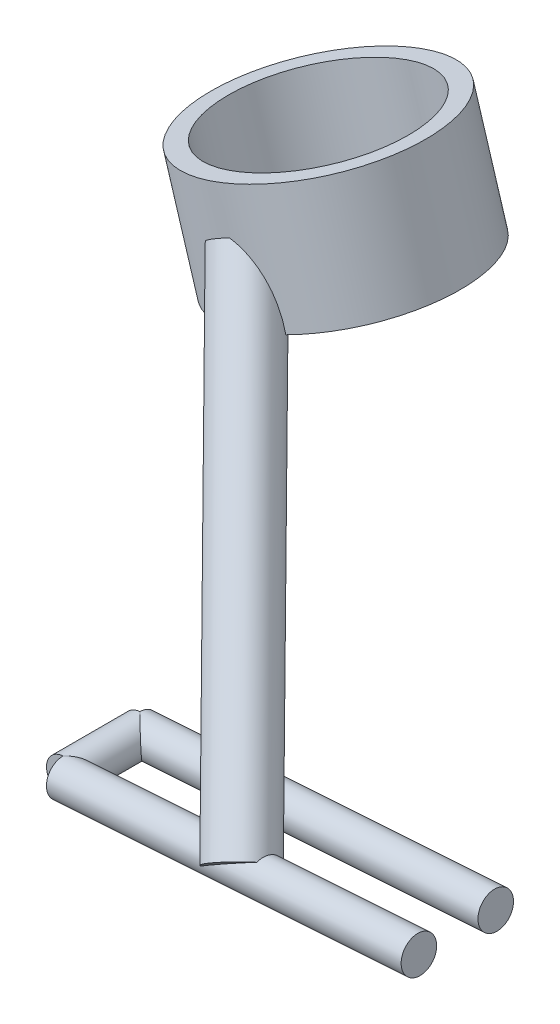
ISO-10303-21;
HEADER;
FILE_DESCRIPTION(('STEP AP214'),'2;1');
FILE_NAME('part.step','',(''),(''),'','','');
FILE_SCHEMA(('AUTOMOTIVE_DESIGN { 1 0 10303 214 1 1 1 1 }'));
ENDSEC;
DATA;
#1=APPLICATION_CONTEXT('core data for automotive mechanical design processes');
#2=APPLICATION_PROTOCOL_DEFINITION('international standard','automotive_design',2000,#1);
#3=PRODUCT_CONTEXT('',#1,'mechanical');
#4=PRODUCT('Part','Part','',(#3));
#5=PRODUCT_RELATED_PRODUCT_CATEGORY('part','',(#4));
#6=PRODUCT_DEFINITION_FORMATION('','',#4);
#7=PRODUCT_DEFINITION_CONTEXT('part definition',#1,'design');
#8=PRODUCT_DEFINITION('design','',#6,#7);
#9=PRODUCT_DEFINITION_SHAPE('','',#8);
#10=(LENGTH_UNIT() NAMED_UNIT(*) SI_UNIT(.MILLI.,.METRE.));
#11=(NAMED_UNIT(*) PLANE_ANGLE_UNIT() SI_UNIT($,.RADIAN.));
#12=(NAMED_UNIT(*) SI_UNIT($,.STERADIAN.) SOLID_ANGLE_UNIT());
#13=UNCERTAINTY_MEASURE_WITH_UNIT(LENGTH_MEASURE(1.E-05),#10,'distance_accuracy_value','');
#14=(GEOMETRIC_REPRESENTATION_CONTEXT(3) GLOBAL_UNCERTAINTY_ASSIGNED_CONTEXT((#13)) GLOBAL_UNIT_ASSIGNED_CONTEXT((#10,
#11,#12)) REPRESENTATION_CONTEXT('',''));
#15=CARTESIAN_POINT('',(0.,0.,0.));
#16=DIRECTION('',(0.,0.,1.));
#17=DIRECTION('',(1.,0.,0.));
#18=AXIS2_PLACEMENT_3D('',#15,#16,#17);
#19=CARTESIAN_POINT('',(-50.,118.,50.));
#20=DIRECTION('',(0.,0.,1.));
#21=DIRECTION('',(1.,0.,0.));
#22=AXIS2_PLACEMENT_3D('',#19,#20,#21);
#23=PLANE('',#22);
#24=CARTESIAN_POINT('',(-50.,118.,50.));
#25=DIRECTION('',(0.,0.,1.));
#26=DIRECTION('',(1.,0.,0.));
#27=AXIS2_PLACEMENT_3D('',#24,#25,#26);
#28=CIRCLE('',#27,3.);
#29=CARTESIAN_POINT('',(-50.1995570315713,120.99335547357,50.));
#30=VERTEX_POINT('',#29);
#31=CARTESIAN_POINT('',(-49.8004429684287,115.00664452643,50.));
#32=VERTEX_POINT('',#31);
#33=EDGE_CURVE('E398',#30,#32,#28,.T.);
#34=ORIENTED_EDGE('',*,*,#33,.T.);
#35=DIRECTION('',(-0.0665190105237742,0.997785157856609,0.));
#36=VECTOR('',#35,1.);
#37=CARTESIAN_POINT('',(-50.,118.,50.));
#38=LINE('',#37,#36);
#39=EDGE_CURVE('E200',#32,#30,#38,.T.);
#40=ORIENTED_EDGE('',*,*,#39,.T.);
#41=EDGE_LOOP('',(#34,#40));
#42=FACE_BOUND('',#41,.T.);
#43=ADVANCED_FACE('F69',(#42),#23,.T.);
#44=CARTESIAN_POINT('',(-50.,118.,37.));
#45=DIRECTION('',(0.997785157856609,0.0665190105237742,0.));
#46=DIRECTION('',(-0.0665190105237742,0.997785157856609,0.));
#47=AXIS2_PLACEMENT_3D('',#44,#45,#46);
#48=PLANE('',#47);
#49=DIRECTION('',(0.0665190105237742,-0.997785157856609,0.));
#50=VECTOR('',#49,1.);
#51=CARTESIAN_POINT('',(-50.,118.,37.));
#52=LINE('',#51,#50);
#53=CARTESIAN_POINT('',(-50.1995570315713,120.99335547357,37.));
#54=VERTEX_POINT('',#53);
#55=CARTESIAN_POINT('',(-49.8004429684287,115.00664452643,37.));
#56=VERTEX_POINT('',#55);
#57=EDGE_CURVE('E249',#54,#56,#52,.T.);
#58=ORIENTED_EDGE('',*,*,#57,.F.);
#59=CARTESIAN_POINT('',(-50.,118.,37.));
#60=DIRECTION('',(0.997785157856609,0.0665190105237742,0.));
#61=DIRECTION('',(-0.0665190105237742,0.997785157856609,0.));
#62=AXIS2_PLACEMENT_3D('',#59,#60,#61);
#63=CIRCLE('',#62,3.);
#64=EDGE_CURVE('E245',#56,#54,#63,.T.);
#65=ORIENTED_EDGE('',*,*,#64,.F.);
#66=EDGE_LOOP('',(#58,#65));
#67=FACE_BOUND('',#66,.T.);
#68=ADVANCED_FACE('F71',(#67),#48,.F.);
#69=CARTESIAN_POINT('',(10.,122.,37.));
#70=DIRECTION('',(0.997785157856609,0.0665190105237742,0.));
#71=DIRECTION('',(-0.0665190105237742,0.997785157856609,0.));
#72=AXIS2_PLACEMENT_3D('',#69,#70,#71);
#73=PLANE('',#72);
#74=CARTESIAN_POINT('',(10.,122.,37.));
#75=DIRECTION('',(0.997785157856609,0.0665190105237742,0.));
#76=DIRECTION('',(-0.0665190105237742,0.997785157856609,0.));
#77=AXIS2_PLACEMENT_3D('',#74,#75,#76);
#78=CIRCLE('',#77,3.);
#79=CARTESIAN_POINT('',(9.80044296842868,124.99335547357,37.));
#80=VERTEX_POINT('',#79);
#81=EDGE_CURVE('E242',#80,#80,#78,.T.);
#82=ORIENTED_EDGE('',*,*,#81,.T.);
#83=EDGE_LOOP('',(#82));
#84=FACE_BOUND('',#83,.T.);
#85=ADVANCED_FACE('F223',(#84),#73,.T.);
#86=CARTESIAN_POINT('',(-50.,118.,37.));
#87=DIRECTION('',(0.997785157856609,0.066519010523774,0.));
#88=DIRECTION('',(-0.066519010523774,0.997785157856609,0.));
#89=AXIS2_PLACEMENT_3D('',#86,#87,#88);
#90=CYLINDRICAL_SURFACE('',#89,3.);
#91=CARTESIAN_POINT('',(-50.,118.,37.));
#92=DIRECTION('',(0.705540651287698,0.0470360434191799,-0.707106781186547));
#93=DIRECTION('',(0.705540651287698,0.0470360434191799,0.707106781186547));
#94=AXIS2_PLACEMENT_3D('',#91,#92,#93);
#95=ELLIPSE('',#94,4.24264068711929,3.);
#96=EDGE_CURVE('E244',#56,#54,#95,.F.);
#97=ORIENTED_EDGE('',*,*,#96,.F.);
#98=ORIENTED_EDGE('',*,*,#64,.T.);
#99=EDGE_LOOP('',(#97,#98));
#100=FACE_BOUND('',#99,.T.);
#101=ORIENTED_EDGE('',*,*,#81,.F.);
#102=EDGE_LOOP('',(#101));
#103=FACE_BOUND('',#102,.T.);
#104=ADVANCED_FACE('F225',(#100,#103),#90,.T.);
#105=CARTESIAN_POINT('',(-50.,118.,37.));
#106=DIRECTION('',(0.,0.,1.));
#107=DIRECTION('',(1.,0.,0.));
#108=AXIS2_PLACEMENT_3D('',#105,#106,#107);
#109=PLANE('',#108);
#110=CARTESIAN_POINT('',(-50.,118.,37.));
#111=DIRECTION('',(0.,0.,1.));
#112=DIRECTION('',(1.,0.,0.));
#113=AXIS2_PLACEMENT_3D('',#110,#111,#112);
#114=CIRCLE('',#113,3.);
#115=EDGE_CURVE('E396',#54,#56,#114,.T.);
#116=ORIENTED_EDGE('',*,*,#115,.F.);
#117=ORIENTED_EDGE('',*,*,#57,.T.);
#118=EDGE_LOOP('',(#116,#117));
#119=FACE_BOUND('',#118,.T.);
#120=ADVANCED_FACE('F230',(#119),#109,.F.);
#121=CARTESIAN_POINT('',(-50.,118.,37.));
#122=DIRECTION('',(0.,0.,1.));
#123=DIRECTION('',(1.,0.,0.));
#124=AXIS2_PLACEMENT_3D('',#121,#122,#123);
#125=CYLINDRICAL_SURFACE('',#124,3.);
#126=CARTESIAN_POINT('',(-50.,118.,50.));
#127=DIRECTION('',(0.705540651287698,0.0470360434191799,0.707106781186547));
#128=DIRECTION('',(-0.705540651287698,-0.0470360434191799,0.707106781186547));
#129=AXIS2_PLACEMENT_3D('',#126,#127,#128);
#130=ELLIPSE('',#129,4.24264068711929,3.);
#131=EDGE_CURVE('E83',#32,#30,#130,.T.);
#132=ORIENTED_EDGE('',*,*,#131,.F.);
#133=ORIENTED_EDGE('',*,*,#33,.F.);
#134=EDGE_LOOP('',(#132,#133));
#135=FACE_BOUND('',#134,.T.);
#136=ORIENTED_EDGE('',*,*,#115,.T.);
#137=ORIENTED_EDGE('',*,*,#96,.T.);
#138=EDGE_LOOP('',(#136,#137));
#139=FACE_BOUND('',#138,.T.);
#140=ADVANCED_FACE('F228',(#135,#139),#125,.T.);
#141=CARTESIAN_POINT('',(-20.,120.,50.));
#142=DIRECTION('',(0.4544555456866,-0.75878267168413,0.466603701385435));
#143=DIRECTION('',(0.,-0.523820970586938,-0.851828381056512));
#144=AXIS2_PLACEMENT_3D('',#141,#142,#143);
#145=PLANE('',#144);
#146=CARTESIAN_POINT('',(-20.,120.,50.));
#147=DIRECTION('',(0.4544555456866,-0.75878267168413,0.466603701385435));
#148=DIRECTION('',(0.890123603935285,0.406780465315446,-0.205449805925945));
#149=AXIS2_PLACEMENT_3D('',#146,#147,#148);
#150=ELLIPSE('',#149,7.44462084523085,3.);
#151=CARTESIAN_POINT('',(-16.1920073698225,123.013296060829,51.1913181683782));
#152=VERTEX_POINT('',#151);
#153=CARTESIAN_POINT('',(-23.9727166706864,119.457564546804,52.9871869766666));
#154=VERTEX_POINT('',#153);
#155=EDGE_CURVE('E266',#152,#154,#150,.T.);
#156=ORIENTED_EDGE('',*,*,#155,.F.);
#157=CARTESIAN_POINT('',(-20.,120.,50.));
#158=DIRECTION('',(0.4544555456866,-0.75878267168413,0.466603701385435));
#159=DIRECTION('',(0.,-0.523820970586938,-0.851828381056512));
#160=AXIS2_PLACEMENT_3D('',#157,#158,#159);
#161=CIRCLE('',#160,4.99999999999999);
#162=EDGE_CURVE('E147',#152,#154,#161,.T.);
#163=ORIENTED_EDGE('',*,*,#162,.T.);
#164=EDGE_LOOP('',(#156,#163));
#165=FACE_BOUND('',#164,.T.);
#166=ADVANCED_FACE('F276',(#165),#145,.T.);
#167=CARTESIAN_POINT('',(-51.165048326479,167.353332293531,0.));
#168=DIRECTION('',(-0.292371704722738,0.956304755963035,0.));
#169=DIRECTION('',(-0.956304755963035,-0.292371704722738,0.));
#170=AXIS2_PLACEMENT_3D('',#167,#168,#169);
#171=PLANE('',#170);
#172=CARTESIAN_POINT('',(-48.7951496336067,168.077883035891,20.4351205997738));
#173=DIRECTION('',(-0.292371704722738,0.956304755963035,0.));
#174=DIRECTION('',(0.396739659134652,0.121295486348914,0.909881886763936));
#175=AXIS2_PLACEMENT_3D('',#172,#173,#174);
#176=ELLIPSE('',#175,5.82412932391651,4.99999999999999);
#177=CARTESIAN_POINT('',(-44.7359402178958,169.31890789674,17.7708492052637));
#178=VERTEX_POINT('',#177);
#179=CARTESIAN_POINT('',(-47.136958776228,168.584842856706,15.3319234379757));
#180=VERTEX_POINT('',#179);
#181=EDGE_CURVE('E139',#178,#180,#176,.T.);
#182=ORIENTED_EDGE('',*,*,#181,.T.);
#183=CARTESIAN_POINT('',(-51.165048326479,167.353332293531,0.));
#184=DIRECTION('',(-0.292371704722738,0.956304755963035,0.));
#185=DIRECTION('',(-0.956304755963035,-0.292371704722738,0.));
#186=AXIS2_PLACEMENT_3D('',#183,#184,#185);
#187=CIRCLE('',#186,15.9);
#188=CARTESIAN_POINT('',(-52.1660859627407,167.047284374831,15.8655052967829));
#189=VERTEX_POINT('',#188);
#190=EDGE_CURVE('E88',#180,#189,#187,.T.);
#191=ORIENTED_EDGE('',*,*,#190,.T.);
#192=CARTESIAN_POINT('',(-53.6483426976925,166.594113013158,18.8217118018051));
#193=VERTEX_POINT('',#192);
#194=EDGE_CURVE('E137',#189,#193,#176,.T.);
#195=ORIENTED_EDGE('',*,*,#194,.T.);
#196=CARTESIAN_POINT('',(-51.165048326479,167.353332293531,0.));
#197=DIRECTION('',(-0.292371704722738,0.956304755963035,0.));
#198=DIRECTION('',(-0.956304755963035,-0.292371704722738,0.));
#199=AXIS2_PLACEMENT_3D('',#196,#197,#198);
#200=CIRCLE('',#199,19.);
#201=EDGE_CURVE('E149',#178,#193,#200,.T.);
#202=ORIENTED_EDGE('',*,*,#201,.F.);
#203=EDGE_LOOP('',(#182,#191,#195,#202));
#204=FACE_BOUND('',#203,.T.);
#205=ADVANCED_FACE('F135',(#204),#171,.F.);
#206=CARTESIAN_POINT('',(-57.0124824209337,186.479427412792,0.));
#207=DIRECTION('',(-0.292371704722738,0.956304755963035,0.));
#208=DIRECTION('',(-0.956304755963035,-0.292371704722738,0.));
#209=AXIS2_PLACEMENT_3D('',#206,#207,#208);
#210=PLANE('',#209);
#211=CARTESIAN_POINT('',(-57.0124824209337,186.479427412792,0.));
#212=DIRECTION('',(-0.292371704722738,0.956304755963035,0.));
#213=DIRECTION('',(-0.956304755963035,-0.292371704722738,0.));
#214=AXIS2_PLACEMENT_3D('',#211,#212,#213);
#215=CIRCLE('',#214,15.9);
#216=CARTESIAN_POINT('',(-72.217728040746,181.8307173077,0.));
#217=VERTEX_POINT('',#216);
#218=EDGE_CURVE('E140',#217,#217,#215,.T.);
#219=ORIENTED_EDGE('',*,*,#218,.F.);
#220=EDGE_LOOP('',(#219));
#221=FACE_BOUND('',#220,.T.);
#222=CARTESIAN_POINT('',(-57.0124824209337,186.479427412792,0.));
#223=DIRECTION('',(-0.292371704722738,0.956304755963035,0.));
#224=DIRECTION('',(-0.956304755963035,-0.292371704722738,0.));
#225=AXIS2_PLACEMENT_3D('',#222,#223,#224);
#226=CIRCLE('',#225,19.);
#227=CARTESIAN_POINT('',(-75.1822727842314,180.92436502306,0.));
#228=VERTEX_POINT('',#227);
#229=EDGE_CURVE('E156',#228,#228,#226,.T.);
#230=ORIENTED_EDGE('',*,*,#229,.T.);
#231=EDGE_LOOP('',(#230));
#232=FACE_BOUND('',#231,.T.);
#233=ADVANCED_FACE('F289',(#221,#232),#210,.T.);
#234=CARTESIAN_POINT('',(-51.165048326479,167.353332293531,0.));
#235=DIRECTION('',(-0.292371704722737,0.956304755963035,0.));
#236=DIRECTION('',(-0.956304755963035,-0.292371704722737,0.));
#237=AXIS2_PLACEMENT_3D('',#234,#235,#236);
#238=CYLINDRICAL_SURFACE('',#237,19.);
#239=CARTESIAN_POINT('',(-44.7359402178952,169.31890789674,17.7708492052635));
#240=CARTESIAN_POINT('',(-44.7981550034029,169.57158532465,17.765398878684));
#241=CARTESIAN_POINT('',(-44.8653622964794,169.823064345294,17.7618880786351));
#242=CARTESIAN_POINT('',(-45.0094854446477,170.323251078132,17.7586950612592));
#243=CARTESIAN_POINT('',(-45.0864013154314,170.571958785845,17.7590128501204));
#244=CARTESIAN_POINT('',(-45.2497979607863,171.066630220814,17.7634301530115));
#245=CARTESIAN_POINT('',(-45.3362941147103,171.312588817292,17.7675358275343));
#246=CARTESIAN_POINT('',(-45.5186437970478,171.800903822842,17.7794796225521));
#247=CARTESIAN_POINT('',(-45.6144973505146,172.043260222267,17.7873177530405));
#248=CARTESIAN_POINT('',(-45.917987929429,172.768832596147,17.8165212060339));
#249=CARTESIAN_POINT('',(-46.1400283051183,173.245911553129,17.8435327060926));
#250=CARTESIAN_POINT('',(-46.6231111391279,174.178490575276,17.9116670199019));
#251=CARTESIAN_POINT('',(-46.8841215277351,174.634007981963,17.9527782662536));
#252=CARTESIAN_POINT('',(-47.3393952427895,175.347808838983,18.0293637142884));
#253=CARTESIAN_POINT('',(-47.5208546934451,175.614721590652,18.0609506846691));
#254=CARTESIAN_POINT('',(-47.9002340405629,176.136102270396,18.1283275015217));
#255=CARTESIAN_POINT('',(-48.0981539904796,176.390570158054,18.1641173616423));
#256=CARTESIAN_POINT('',(-48.5108207558986,176.884194127381,18.2390648832261));
#257=CARTESIAN_POINT('',(-48.7255360643331,177.123377419325,18.2782162515716));
#258=CARTESIAN_POINT('',(-49.172855223433,177.583944556306,18.3589085457684));
#259=CARTESIAN_POINT('',(-49.4054526955307,177.805334691054,18.4004486182486));
#260=CARTESIAN_POINT('',(-49.8129447577446,178.160173889385,18.4712832276608));
#261=CARTESIAN_POINT('',(-49.9829159847655,178.299345180873,18.5003101143732));
#262=CARTESIAN_POINT('',(-50.3317121158053,178.566100063499,18.5582802480918));
#263=CARTESIAN_POINT('',(-50.5105347336298,178.693686622935,18.5872235146729));
#264=CARTESIAN_POINT('',(-50.876449507288,178.935079137969,18.6442698915182));
#265=CARTESIAN_POINT('',(-51.0635081604642,179.048934946216,18.6723757438751));
#266=CARTESIAN_POINT('',(-51.4463185414441,179.261230750808,18.7270755272271));
#267=CARTESIAN_POINT('',(-51.6420664080009,179.359677508204,18.7536701180395));
#268=CARTESIAN_POINT('',(-52.0531993731283,179.543606880596,18.8058826143818));
#269=CARTESIAN_POINT('',(-52.2690709778149,179.628062162525,18.8313636419685));
#270=CARTESIAN_POINT('',(-52.5995407764516,179.736929190587,18.8666916785003));
#271=CARTESIAN_POINT('',(-52.711065408875,179.770303569377,18.8780075421171));
#272=CARTESIAN_POINT('',(-52.9360823585628,179.830437404996,18.8994860843947));
#273=CARTESIAN_POINT('',(-53.0495761516738,179.857191648775,18.9096478508725));
#274=CARTESIAN_POINT('',(-53.1639136733173,179.880325177426,18.9191424377096));
#275=B_SPLINE_CURVE_WITH_KNOTS('',3,(#239,#240,#241,#242,#243,#244,#245,#246,#247,#248,#249,
#250,#251,#252,#253,#254,#255,#256,#257,#258,#259,#260,#261,#262,#263,#264,#265,#266,#267,#268,
#269,#270,#271,#272,#273,#274),.UNSPECIFIED.,.F.,.F.,(4,2,2,2,2,2,2,2,2,2,2,2,2,2,2,2,2,4),(0.,
0.780768583486301,1.56153842893732,2.34358033553401,3.12562433601042,4.70432229935082,
6.28172818846943,7.25403359755789,8.22634216426876,9.19686857611546,10.1670503932183,
10.8314035115998,11.4955859229537,12.1572792262298,12.8186813785201,13.5169181100551,
13.8676129234642,14.2185830202255),.UNSPECIFIED.);
#276=CARTESIAN_POINT('',(-53.163913673317,179.880325177427,18.9191424377095));
#277=VERTEX_POINT('',#276);
#278=EDGE_CURVE('E182',#178,#277,#275,.T.);
#279=ORIENTED_EDGE('',*,*,#278,.F.);
#280=ORIENTED_EDGE('',*,*,#201,.T.);
#281=CARTESIAN_POINT('',(-57.3721179207626,177.259150355823,18.7552768785063));
#282=CARTESIAN_POINT('',(-57.3925154870222,177.153268702976,18.7470928551168));
#283=CARTESIAN_POINT('',(-57.4093735761702,177.046729109545,18.7392281145335));
#284=CARTESIAN_POINT('',(-57.4366442601491,176.832863088633,18.724180293514));
#285=CARTESIAN_POINT('',(-57.4470621543603,176.725537381801,18.716996656757));
#286=CARTESIAN_POINT('',(-57.4620874258827,176.510880380761,18.7033677134032));
#287=CARTESIAN_POINT('',(-57.4667177702764,176.403550809811,18.6969195813008));
#288=CARTESIAN_POINT('',(-57.4708081079155,176.188739933469,18.6847345180511));
#289=CARTESIAN_POINT('',(-57.4702669152274,176.081258598926,18.678997750339));
#290=CARTESIAN_POINT('',(-57.4617447436949,175.762093094058,18.6630070566001));
#291=CARTESIAN_POINT('',(-57.4470526277329,175.550522662224,18.6537730972221));
#292=CARTESIAN_POINT('',(-57.4028215385403,175.128666360669,18.6379013991281));
#293=CARTESIAN_POINT('',(-57.3732634092571,174.918382503576,18.6312670298668));
#294=CARTESIAN_POINT('',(-57.3055911711209,174.522218252762,18.6209699633984));
#295=CARTESIAN_POINT('',(-57.2687256032068,174.336126831743,18.6170658143973));
#296=CARTESIAN_POINT('',(-57.1864986615936,173.965784542172,18.6109977338095));
#297=CARTESIAN_POINT('',(-57.141135755495,173.781534011927,18.6088341164814));
#298=CARTESIAN_POINT('',(-57.0430153593785,173.414984096212,18.606080366214));
#299=CARTESIAN_POINT('',(-56.9902567890052,173.232685000001,18.605490463415));
#300=CARTESIAN_POINT('',(-56.878217895902,172.870094650926,18.6057243785889));
#301=CARTESIAN_POINT('',(-56.8189368080958,172.689803636341,18.6065483625733));
#302=CARTESIAN_POINT('',(-56.6307276222075,172.147136973577,18.6109503837799));
#303=CARTESIAN_POINT('',(-56.4927876081868,171.787882742235,18.6164875517565));
#304=CARTESIAN_POINT('',(-56.1974474431367,171.077756424711,18.6315938948618));
#305=CARTESIAN_POINT('',(-56.0400514906638,170.726882549497,18.6411622011476));
#306=CARTESIAN_POINT('',(-55.7142407911525,170.045380505961,18.662952502707));
#307=CARTESIAN_POINT('',(-55.5464014574864,169.714472966391,18.6750703586297));
#308=CARTESIAN_POINT('',(-55.1966307767209,169.060277699763,18.7013410156656));
#309=CARTESIAN_POINT('',(-55.0146987976314,168.736990315283,18.7154939080653));
#310=CARTESIAN_POINT('',(-54.6421762299279,168.105893418706,18.744742026733));
#311=CARTESIAN_POINT('',(-54.451897239534,167.797898649979,18.7598065782921));
#312=CARTESIAN_POINT('',(-54.1573837435027,167.341875575819,18.7828285978502));
#313=CARTESIAN_POINT('',(-54.0577062536899,167.19087623769,18.7905727436768));
#314=CARTESIAN_POINT('',(-53.8553082271215,166.89093342129,18.8061194290453));
#315=CARTESIAN_POINT('',(-53.7525876796358,166.741989950271,18.8139219687932));
#316=CARTESIAN_POINT('',(-53.6483426976924,166.594113013158,18.8217118018051));
#317=B_SPLINE_CURVE_WITH_KNOTS('',3,(#281,#282,#283,#284,#285,#286,#287,#288,#289,#290,#291,
#292,#293,#294,#295,#296,#297,#298,#299,#300,#301,#302,#303,#304,#305,#306,#307,#308,#309,#310,
#311,#312,#313,#314,#315,#316),.UNSPECIFIED.,.F.,.F.,(4,2,2,2,2,2,2,2,2,2,2,2,2,2,2,2,2,4),(0.,
0.324286255450192,0.648305312209257,0.97103441961806,1.29383753683144,1.92994926814624,
2.56688278872829,3.1358939937203,3.7050079124527,4.27420505389929,4.8434690321862,
5.9972587496954,7.15079991471299,8.26412718982925,9.37750442147366,10.4642247358901,
11.0074857546594,11.5507486892512),.UNSPECIFIED.);
#318=CARTESIAN_POINT('',(-57.3721179207626,177.259150355823,18.7552768785063));
#319=VERTEX_POINT('',#318);
#320=EDGE_CURVE('E146',#319,#193,#317,.T.);
#321=ORIENTED_EDGE('',*,*,#320,.F.);
#322=CARTESIAN_POINT('',(-51.705152161012,169.119932334967,0.));
#323=DIRECTION('',(0.4544555456866,-0.75878267168413,0.466603701385435));
#324=DIRECTION('',(0.190666535730461,0.594542040934057,0.781131252552675));
#325=AXIS2_PLACEMENT_3D('',#322,#323,#324);
#326=ELLIPSE('',#325,22.1316914308828,19.);
#327=EDGE_CURVE('E165',#319,#277,#326,.F.);
#328=ORIENTED_EDGE('',*,*,#327,.T.);
#329=EDGE_LOOP('',(#279,#280,#321,#328));
#330=FACE_BOUND('',#329,.T.);
#331=ORIENTED_EDGE('',*,*,#229,.F.);
#332=EDGE_LOOP('',(#331));
#333=FACE_BOUND('',#332,.T.);
#334=ADVANCED_FACE('F167',(#330,#333),#238,.T.);
#335=CARTESIAN_POINT('',(-54.0887653737063,176.916379853162,15.));
#336=DIRECTION('',(0.4544555456866,-0.75878267168413,0.466603701385435));
#337=DIRECTION('',(0.,-0.523820970586938,-0.851828381056512));
#338=AXIS2_PLACEMENT_3D('',#335,#336,#337);
#339=PLANE('',#338);
#340=ORIENTED_EDGE('',*,*,#327,.F.);
#341=CARTESIAN_POINT('',(-54.0887653737063,176.916379853162,15.));
#342=DIRECTION('',(0.4544555456866,-0.75878267168413,0.466603701385435));
#343=DIRECTION('',(0.,-0.523820970586938,-0.851828381056512));
#344=AXIS2_PLACEMENT_3D('',#341,#342,#343);
#345=CIRCLE('',#344,4.99999999999999);
#346=EDGE_CURVE('E267',#277,#319,#345,.T.);
#347=ORIENTED_EDGE('',*,*,#346,.F.);
#348=EDGE_LOOP('',(#340,#347));
#349=FACE_BOUND('',#348,.T.);
#350=ADVANCED_FACE('F207',(#349),#339,.F.);
#351=CARTESIAN_POINT('',(-23.8079926301775,116.986703939171,48.8086818316218));
#352=VERTEX_POINT('',#351);
#353=CARTESIAN_POINT('',(-16.0272833293136,120.542435453196,47.0128130233334));
#354=VERTEX_POINT('',#353);
#355=EDGE_CURVE('E260',#352,#354,#150,.T.);
#356=ORIENTED_EDGE('',*,*,#355,.F.);
#357=EDGE_CURVE('E151',#352,#354,#161,.T.);
#358=ORIENTED_EDGE('',*,*,#357,.T.);
#359=EDGE_LOOP('',(#356,#358));
#360=FACE_BOUND('',#359,.T.);
#361=ADVANCED_FACE('F176',(#360),#145,.T.);
#362=CARTESIAN_POINT('',(-54.0887653737063,176.916379853162,15.));
#363=DIRECTION('',(0.4544555456866,-0.75878267168413,0.466603701385435));
#364=DIRECTION('',(0.,-0.523820970586938,-0.851828381056512));
#365=AXIS2_PLACEMENT_3D('',#362,#363,#364);
#366=CYLINDRICAL_SURFACE('',#365,4.99999999999999);
#367=CARTESIAN_POINT('',(-49.8418224488327,179.551060595571,15.1480985430076));
#368=CARTESIAN_POINT('',(-49.7058619667606,179.333061536828,15.1269414228064));
#369=CARTESIAN_POINT('',(-49.5747597943079,179.111932365901,15.1071092157675));
#370=CARTESIAN_POINT('',(-49.3220923847122,178.664093695193,15.0703340428352));
#371=CARTESIAN_POINT('',(-49.2005258262134,178.437384974314,15.05339067625));
#372=CARTESIAN_POINT('',(-48.966667919542,177.97891916423,15.0226207512602));
#373=CARTESIAN_POINT('',(-48.8543801118293,177.747160190253,15.0087953791299));
#374=CARTESIAN_POINT('',(-48.6390182360307,177.279248009057,14.984434164064));
#375=CARTESIAN_POINT('',(-48.5359445106505,177.043094638788,14.9738984434464));
#376=CARTESIAN_POINT('',(-48.2391830383302,176.325790236263,14.9473194006228));
#377=CARTESIAN_POINT('',(-48.0593634951686,175.838570953042,14.9364934532123));
#378=CARTESIAN_POINT('',(-47.8179762393565,175.098728108204,14.931168893834));
#379=CARTESIAN_POINT('',(-47.7422418952675,174.850629551217,14.9312127081486));
#380=CARTESIAN_POINT('',(-47.6004888395298,174.35169899144,14.9349858511764));
#381=CARTESIAN_POINT('',(-47.5344692280339,174.100867244132,14.9387148382956));
#382=CARTESIAN_POINT('',(-47.4056799638529,173.568244948714,14.950544750914));
#383=CARTESIAN_POINT('',(-47.3441276200794,173.286168946089,14.9590934586019));
#384=CARTESIAN_POINT('',(-47.234580417711,172.719571018352,14.9808904218986));
#385=CARTESIAN_POINT('',(-47.1865849014673,172.435049212577,14.9941384494703));
#386=CARTESIAN_POINT('',(-47.1056618531932,171.864497405886,15.0253914627668));
#387=CARTESIAN_POINT('',(-47.0727143234539,171.578469920559,15.0433900847699));
#388=CARTESIAN_POINT('',(-47.0239597056754,171.005314122553,15.0842486062586));
#389=CARTESIAN_POINT('',(-47.0081469914501,170.718186202295,15.1071069071266));
#390=CARTESIAN_POINT('',(-46.9992557630158,170.260547462551,15.1475142070773));
#391=CARTESIAN_POINT('',(-46.9995539828586,170.09001541213,15.1634513332386));
#392=CARTESIAN_POINT('',(-47.0083777131814,169.749352758262,15.1971127710112));
#393=CARTESIAN_POINT('',(-47.0169015342792,169.579222079574,15.2148367149748));
#394=CARTESIAN_POINT('',(-47.0434498222182,169.240024081942,15.2520853011712));
#395=CARTESIAN_POINT('',(-47.0614659608035,169.070955962117,15.2716083525551));
#396=CARTESIAN_POINT('',(-47.108712158161,168.734655098209,15.3124744743056));
#397=CARTESIAN_POINT('',(-47.1379370950418,168.567421551662,15.3338167099316));
#398=CARTESIAN_POINT('',(-47.216345761387,168.206303114152,15.3823037167903));
#399=CARTESIAN_POINT('',(-47.2681690697395,168.013017718914,15.4098026633332));
#400=CARTESIAN_POINT('',(-47.3958020931453,167.634690557662,15.4671207716999));
#401=CARTESIAN_POINT('',(-47.4715840249921,167.449639524942,15.4969372160245));
#402=CARTESIAN_POINT('',(-47.6271838369095,167.147392637682,15.549189193257));
#403=CARTESIAN_POINT('',(-47.6992954382552,167.026216710539,15.5712238816429));
#404=CARTESIAN_POINT('',(-47.8613974059736,166.796453041391,15.6155010418895));
#405=CARTESIAN_POINT('',(-47.9513545520544,166.687842494366,15.6377430555662));
#406=CARTESIAN_POINT('',(-48.1301840394429,166.509527938964,15.6769936122841));
#407=CARTESIAN_POINT('',(-48.215581494907,166.436399897282,15.6941492568362));
#408=CARTESIAN_POINT('',(-48.3977049641886,166.305613113087,15.7272196472299));
#409=CARTESIAN_POINT('',(-48.494419329194,166.247938661531,15.7431356414463));
#410=CARTESIAN_POINT('',(-48.6970437183565,166.150498113628,15.7730324396765));
#411=CARTESIAN_POINT('',(-48.8029737169243,166.11077213411,15.7870088607307));
#412=CARTESIAN_POINT('',(-49.0203655855926,166.050029668293,15.8124728394907));
#413=CARTESIAN_POINT('',(-49.131832614443,166.029030988601,15.8239580205997));
#414=CARTESIAN_POINT('',(-49.3864156357636,166.00120095862,15.846933541304));
#415=CARTESIAN_POINT('',(-49.5301482203727,165.999545290333,15.8576314853498));
#416=CARTESIAN_POINT('',(-49.8162709085354,166.018908164498,15.8750972367222));
#417=CARTESIAN_POINT('',(-49.9586578515895,166.039970881688,15.8818573477061));
#418=CARTESIAN_POINT('',(-50.2159439891774,166.094577207496,15.8911845993077));
#419=CARTESIAN_POINT('',(-50.3314305005365,166.125418160987,15.8942664777739));
#420=CARTESIAN_POINT('',(-50.5594374754652,166.1968329164,15.8984792195469));
#421=CARTESIAN_POINT('',(-50.6719557124722,166.237413806263,15.8996086570919));
#422=CARTESIAN_POINT('',(-50.8940806186096,166.32649959659,15.9002206429931));
#423=CARTESIAN_POINT('',(-51.0036797471524,166.37502306735,15.8996992779609));
#424=CARTESIAN_POINT('',(-51.2197432099687,166.478455521183,15.8972592271587));
#425=CARTESIAN_POINT('',(-51.3262083193524,166.533362908462,15.8953408899627));
#426=CARTESIAN_POINT('',(-51.5718183963117,166.667973566482,15.8894679161557));
#427=CARTESIAN_POINT('',(-51.709801175057,166.749770872234,15.8850433273612));
#428=CARTESIAN_POINT('',(-51.9809988440969,166.920866886639,15.874470149288));
#429=CARTESIAN_POINT('',(-52.1142116460919,167.010168824921,15.8683208150739));
#430=CARTESIAN_POINT('',(-52.3764625519456,167.194972464898,15.8545968975334));
#431=CARTESIAN_POINT('',(-52.5054942501151,167.290483062595,15.8470202382276));
#432=CARTESIAN_POINT('',(-52.7595945120146,167.486557971111,15.8306888345535));
#433=CARTESIAN_POINT('',(-52.8846623908874,167.587123147568,15.8219338879603));
#434=CARTESIAN_POINT('',(-53.2564719953067,167.896854315583,15.7940522439654));
#435=CARTESIAN_POINT('',(-53.4976958402647,168.11252338787,15.7734272347753));
#436=CARTESIAN_POINT('',(-53.9674913209153,168.556428257764,15.7294374114704));
#437=CARTESIAN_POINT('',(-54.1960731119597,168.784653665993,15.7060748449077));
#438=CARTESIAN_POINT('',(-54.6167273647267,169.22434938008,15.6602489660757));
#439=CARTESIAN_POINT('',(-54.8099733029836,169.434723570062,15.6379917942902));
#440=CARTESIAN_POINT('',(-55.1888194899734,169.86216373958,15.5924615580888));
#441=CARTESIAN_POINT('',(-55.3744188985554,170.079230449888,15.5691883826164));
#442=CARTESIAN_POINT('',(-55.738693524282,170.519349779037,15.5220141426931));
#443=CARTESIAN_POINT('',(-55.9173623843079,170.742407590102,15.4981125340114));
#444=CARTESIAN_POINT('',(-56.2680051660394,171.193700687147,15.4500683201154));
#445=CARTESIAN_POINT('',(-56.4399789364117,171.421936089974,15.4259257094691));
#446=CARTESIAN_POINT('',(-56.7711008463232,171.874424398089,15.3786580369577));
#447=CARTESIAN_POINT('',(-56.9304880767893,172.098502125509,15.3555289836126));
#448=CARTESIAN_POINT('',(-57.2433864980758,172.550763237652,15.309678490623));
#449=CARTESIAN_POINT('',(-57.3968976823668,172.778946626935,15.2869570514314));
#450=CARTESIAN_POINT('',(-57.6977281203346,173.238767406824,15.2422824663861));
#451=CARTESIAN_POINT('',(-57.8450593286155,173.470396831645,15.2203278523944));
#452=CARTESIAN_POINT('',(-58.1336905081728,173.937475115402,15.1774820416483));
#453=CARTESIAN_POINT('',(-58.274990560529,174.172923922934,15.1565908305972));
#454=CARTESIAN_POINT('',(-58.4131923471511,174.410242260562,15.1364027796805));
#455=B_SPLINE_CURVE_WITH_KNOTS('',3,(#367,#368,#369,#370,#371,#372,#373,#374,#375,#376,#377,
#378,#379,#380,#381,#382,#383,#384,#385,#386,#387,#388,#389,#390,#391,#392,#393,#394,#395,#396,
#397,#398,#399,#400,#401,#402,#403,#404,#405,#406,#407,#408,#409,#410,#411,#412,#413,#414,#415,
#416,#417,#418,#419,#420,#421,#422,#423,#424,#425,#426,#427,#428,#429,#430,#431,#432,#433,#434,
#435,#436,#437,#438,#439,#440,#441,#442,#443,#444,#445,#446,#447,#448,#449,#450,#451,#452,#453,
#454),.UNSPECIFIED.,.F.,.F.,(4,2,2,2,2,2,2,2,2,2,2,2,2,2,2,2,2,2,2,2,2,2,2,2,2,2,2,2,2,2,2,2,2,
2,2,2,2,2,2,2,2,2,2,4),(0.,0.773269713424808,1.54643208439297,2.31988811886563,3.09337290905489,
4.64967186547395,5.42771019424443,6.2056764101746,7.07185462081097,7.93799080546071,
8.80297258311677,9.6676702594007,10.1813281801916,10.6948806278503,11.2079832494832,
11.7208516862558,12.3257047607361,12.9298589846959,13.356772382895,13.7828983964335,
14.1226645601568,14.4620840195754,14.8022584110243,15.1427559090332,15.5727666568991,
16.0036150484786,16.3618301264088,16.720306679045,17.0796336709959,17.4388710340032,
17.9199406228899,18.401218311514,18.8832014780206,19.365267471168,20.3372450937014,
21.3084302350872,22.167802234527,23.0272684057186,23.8875051372064,24.7477613018922,
25.5755254381573,26.4032904942077,27.2293725723816,28.0554435416142),.UNSPECIFIED.);
#456=EDGE_CURVE('E12',#180,#189,#455,.T.);
#457=ORIENTED_EDGE('',*,*,#456,.F.);
#458=ORIENTED_EDGE('',*,*,#181,.F.);
#459=ORIENTED_EDGE('',*,*,#278,.T.);
#460=ORIENTED_EDGE('',*,*,#346,.T.);
#461=ORIENTED_EDGE('',*,*,#320,.T.);
#462=ORIENTED_EDGE('',*,*,#194,.F.);
#463=EDGE_LOOP('',(#457,#458,#459,#460,#461,#462));
#464=FACE_BOUND('',#463,.T.);
#465=CARTESIAN_POINT('',(-26.5232161707379,122.571778197625,50.));
#466=CARTESIAN_POINT('',(-26.5862414536458,122.567577319656,49.8800293702979));
#467=CARTESIAN_POINT('',(-26.6445665735445,122.556486847123,49.7576946542791));
#468=CARTESIAN_POINT('',(-26.7484102665781,122.518968106331,49.5096596114984));
#469=CARTESIAN_POINT('',(-26.7939197254973,122.492528963141,49.3839569587619));
#470=CARTESIAN_POINT('',(-26.8498921895713,122.440347700691,49.1945133677493));
#471=CARTESIAN_POINT('',(-26.866558146145,122.420723723805,49.1308647065682));
#472=CARTESIAN_POINT('',(-26.895199871837,122.37722073968,49.003981493955));
#473=CARTESIAN_POINT('',(-26.9071780265807,122.353343905748,48.9407467480339));
#474=CARTESIAN_POINT('',(-26.9260565919115,122.301392636478,48.8153224206932));
#475=CARTESIAN_POINT('',(-26.932962573927,122.273322847731,48.7531317660343));
#476=CARTESIAN_POINT('',(-26.9414699067752,122.213147310475,48.6303870750948));
#477=CARTESIAN_POINT('',(-26.9430720248568,122.181042146416,48.5698328033545));
#478=CARTESIAN_POINT('',(-26.9399857517249,122.087146633499,48.4057290443219));
#479=CARTESIAN_POINT('',(-26.9295893030217,122.021343622022,48.3044899499152));
#480=CARTESIAN_POINT('',(-26.8926457158677,121.880284897193,48.1121411467798));
#481=CARTESIAN_POINT('',(-26.8660921971719,121.805025458925,48.0210354564372));
#482=CARTESIAN_POINT('',(-26.8000728873167,121.650287504797,47.8535546486674));
#483=CARTESIAN_POINT('',(-26.7610584227995,121.571027865079,47.7767948398203));
#484=CARTESIAN_POINT('',(-26.6723534389856,121.408259679122,47.6349608324527));
#485=CARTESIAN_POINT('',(-26.6226597267569,121.324749867859,47.5698901395051));
#486=CARTESIAN_POINT('',(-26.4837139722676,121.10579954701,47.4167601655789));
#487=CARTESIAN_POINT('',(-26.3882337707149,120.968328720705,47.3372535324419));
#488=CARTESIAN_POINT('',(-26.1842229975797,120.690220167373,47.2043576268757));
#489=CARTESIAN_POINT('',(-26.0756521503527,120.549573807532,47.1510516576323));
#490=CARTESIAN_POINT('',(-25.8883801098081,120.313477826389,47.0820582242624));
#491=CARTESIAN_POINT('',(-25.8115830104672,120.218358713411,47.0597654388368));
#492=CARTESIAN_POINT('',(-25.6562049142531,120.027637529564,47.0255598548866));
#493=CARTESIAN_POINT('',(-25.577623204414,119.932035277972,47.0136512825413));
#494=CARTESIAN_POINT('',(-25.4200390741974,119.740448137319,47.000017004403));
#495=CARTESIAN_POINT('',(-25.3410366069168,119.644463205913,46.998292458689));
#496=CARTESIAN_POINT('',(-25.1839404931019,119.452147602868,47.0050845364131));
#497=CARTESIAN_POINT('',(-25.1058465466584,119.355817059897,47.0135976775385));
#498=CARTESIAN_POINT('',(-24.9687378500493,119.183893561718,47.0381853324132));
#499=CARTESIAN_POINT('',(-24.9092782513435,119.108362198553,47.0522045714649));
#500=CARTESIAN_POINT('',(-24.7924936485572,118.957199342723,47.086969159611));
#501=CARTESIAN_POINT('',(-24.7351691452604,118.881567830822,47.1077160757342));
#502=CARTESIAN_POINT('',(-24.5678781788852,118.655080273891,47.1804888818592));
#503=CARTESIAN_POINT('',(-24.4621908042161,118.504136684146,47.2431128092372));
#504=CARTESIAN_POINT('',(-24.2916454631203,118.239534458824,47.3819822523996));
#505=CARTESIAN_POINT('',(-24.2229460748284,118.125104220033,47.4520254174457));
#506=CARTESIAN_POINT('',(-24.1005210616209,117.901880759048,47.6115617298023));
#507=CARTESIAN_POINT('',(-24.0467810625557,117.793082207911,47.7010360579057));
#508=CARTESIAN_POINT('',(-23.9560432054699,117.585198461526,47.8988966060613));
#509=CARTESIAN_POINT('',(-23.9191158423646,117.486155505766,48.0073598640904));
#510=CARTESIAN_POINT('',(-23.8618066608098,117.302975361333,48.2401436440682));
#511=CARTESIAN_POINT('',(-23.8414338694615,117.218846324645,48.3644727748812));
#512=CARTESIAN_POINT('',(-23.8151902651602,117.073338973438,48.6177622373013));
#513=CARTESIAN_POINT('',(-23.8085703217093,117.010949456297,48.746071944692));
#514=CARTESIAN_POINT('',(-23.804311398291,116.904495032028,49.0101899376716));
#515=CARTESIAN_POINT('',(-23.8066747229947,116.860434830531,49.1460001387155));
#516=CARTESIAN_POINT('',(-23.817671933325,116.788191974388,49.4363763655647));
#517=CARTESIAN_POINT('',(-23.8269230756953,116.762096895036,49.5914390202006));
#518=CARTESIAN_POINT('',(-23.8486040205914,116.734222185052,49.9035335055852));
#519=CARTESIAN_POINT('',(-23.8610349782187,116.73245140329,50.0605660321563));
#520=CARTESIAN_POINT('',(-23.8869996185576,116.754269284829,50.3847653631628));
#521=CARTESIAN_POINT('',(-23.9005459536139,116.779774157055,50.5518066793538));
#522=CARTESIAN_POINT('',(-23.9251013978765,116.858762220716,50.8793371221815));
#523=CARTESIAN_POINT('',(-23.9361106177601,116.912244191365,51.0398265343823));
#524=CARTESIAN_POINT('',(-23.9539163406851,117.0452914093,51.34833056051));
#525=CARTESIAN_POINT('',(-23.9607460035479,117.124643481662,51.4964351005417));
#526=CARTESIAN_POINT('',(-23.9698803813601,117.307253083075,51.7772275906342));
#527=CARTESIAN_POINT('',(-23.9721854417201,117.410508786638,51.9099167167883));
#528=CARTESIAN_POINT('',(-23.9729558144281,117.636184209538,52.1543275124336));
#529=CARTESIAN_POINT('',(-23.9714752672134,117.758310506229,52.2663205325527));
#530=CARTESIAN_POINT('',(-23.9665133730528,118.019289135045,52.46872100104));
#531=CARTESIAN_POINT('',(-23.9630316286966,118.158144785059,52.5591241569102));
#532=CARTESIAN_POINT('',(-23.956749605935,118.451533805038,52.7175505121659));
#533=CARTESIAN_POINT('',(-23.9539636634502,118.606316596427,52.7851116966397));
#534=CARTESIAN_POINT('',(-23.9531452622238,118.925166636345,52.8935972462722));
#535=CARTESIAN_POINT('',(-23.9551141363712,119.089236475667,52.9345141383146));
#536=CARTESIAN_POINT('',(-23.9653043024811,119.338049850869,52.9748433865828));
#537=CARTESIAN_POINT('',(-23.9698988439873,119.421353139311,52.9847793405613));
#538=CARTESIAN_POINT('',(-23.9821490853806,119.588264170868,52.9976207439319));
#539=CARTESIAN_POINT('',(-23.989803247775,119.671871740201,53.0005297192934));
#540=CARTESIAN_POINT('',(-24.0087869840411,119.838530214388,52.999312267384));
#541=CARTESIAN_POINT('',(-24.0201126785299,119.921581612777,52.9951932464756));
#542=CARTESIAN_POINT('',(-24.0469864027997,120.086361096219,52.9800452904619));
#543=CARTESIAN_POINT('',(-24.0625338270154,120.168089369281,52.9690173460769));
#544=CARTESIAN_POINT('',(-24.0964275615212,120.321147665919,52.9417658238447));
#545=CARTESIAN_POINT('',(-24.1143295361901,120.392691048471,52.9261833093548));
#546=CARTESIAN_POINT('',(-24.1540032469056,120.533403687336,52.8899315141719));
#547=CARTESIAN_POINT('',(-24.1757762176273,120.602572177742,52.8692606096979));
#548=CARTESIAN_POINT('',(-24.2231661646202,120.73792928244,52.8232206502649));
#549=CARTESIAN_POINT('',(-24.2487815391714,120.804119123517,52.7978535519045));
#550=CARTESIAN_POINT('',(-24.3036944777546,120.933124250322,52.7428525766703));
#551=CARTESIAN_POINT('',(-24.3329934897656,120.995938195102,52.7132170212635));
#552=CARTESIAN_POINT('',(-24.4227504451788,121.172410265443,52.6219107928556));
#553=CARTESIAN_POINT('',(-24.4876457273357,121.281314361102,52.5552884234047));
#554=CARTESIAN_POINT('',(-24.6269577236015,121.484909466382,52.4113410645064));
#555=CARTESIAN_POINT('',(-24.7013804419514,121.579591430652,52.334009323421));
#556=CARTESIAN_POINT('',(-24.8401044577464,121.736242084485,52.1883838441433));
#557=CARTESIAN_POINT('',(-24.90315076178,121.800870766606,52.1217115330431));
#558=CARTESIAN_POINT('',(-25.032060204575,121.921984951997,51.9837826097499));
#559=CARTESIAN_POINT('',(-25.0979247418084,121.978466350184,51.9125237125329));
#560=CARTESIAN_POINT('',(-25.2314975833847,122.083768440568,51.7656785256175));
#561=CARTESIAN_POINT('',(-25.2992110307828,122.132564504311,51.6900793422853));
#562=CARTESIAN_POINT('',(-25.4352267545707,122.222549619159,51.5350306001529));
#563=CARTESIAN_POINT('',(-25.503528925179,122.263740008207,51.4555817216777));
#564=CARTESIAN_POINT('',(-25.6416658211813,122.339705969904,51.2906636205294));
#565=CARTESIAN_POINT('',(-25.7114904269334,122.37427161546,51.2050884775214));
#566=CARTESIAN_POINT('',(-25.8496746735718,122.43548121545,51.0300507938031));
#567=CARTESIAN_POINT('',(-25.9180338903385,122.462122904468,50.9405871497552));
#568=CARTESIAN_POINT('',(-26.1187208950435,122.529633725588,50.6670931736025));
#569=CARTESIAN_POINT('',(-26.2474965164126,122.558540116896,50.4769888831789));
#570=CARTESIAN_POINT('',(-26.3931431971878,122.571639478485,50.234051439528));
#571=CARTESIAN_POINT('',(-26.4200747692665,122.57312238632,50.187791025359));
#572=CARTESIAN_POINT('',(-26.4726550751966,122.574022803106,50.0944772521879));
#573=CARTESIAN_POINT('',(-26.4983028351435,122.573438767445,50.0474233263436));
#574=CARTESIAN_POINT('',(-26.5232161707379,122.571778197625,50.));
#575=B_SPLINE_CURVE_WITH_KNOTS('',3,(#465,#466,#467,#468,#469,#470,#471,#472,#473,#474,#475,
#476,#477,#478,#479,#480,#481,#482,#483,#484,#485,#486,#487,#488,#489,#490,#491,#492,#493,#494,
#495,#496,#497,#498,#499,#500,#501,#502,#503,#504,#505,#506,#507,#508,#509,#510,#511,#512,#513,
#514,#515,#516,#517,#518,#519,#520,#521,#522,#523,#524,#525,#526,#527,#528,#529,#530,#531,#532,
#533,#534,#535,#536,#537,#538,#539,#540,#541,#542,#543,#544,#545,#546,#547,#548,#549,#550,#551,
#552,#553,#554,#555,#556,#557,#558,#559,#560,#561,#562,#563,#564,#565,#566,#567,#568,#569,#570,
#571,#572,#573,#574),.UNSPECIFIED.,.T.,.F.,(4,2,2,2,2,2,2,2,2,2,2,2,2,2,2,2,2,2,2,2,2,2,2,2,2,2,
2,2,2,2,2,2,2,2,2,2,2,2,2,2,2,2,2,2,2,2,2,2,2,2,2,2,2,2,4),(0.,0.406615444663793,
0.813519339147871,1.01924682556033,1.22486948055437,1.4302659342072,1.63563267422289,
1.99712254738608,2.3587552615534,2.70854525934862,3.05843998487896,3.61124863866657,
4.1658037193317,4.53818543800277,4.91071863838375,5.28329427380814,5.65574321480156,
5.94692174956911,6.23816815520122,6.81875440407228,7.26916543597314,7.71914217198301,
8.17098865427718,8.62308136051132,9.04982325024816,9.47667462865166,9.94723061349262,
10.4179577761104,10.924068279608,11.4301567007346,11.9321760165273,12.4341570064058,
12.928999118603,13.4239395335809,13.9283635324229,14.4329289498246,14.6847009740386,
14.9363466388171,15.1877272738434,15.4390718698354,15.6649018140444,15.890803917583,
16.1166121133578,16.3425093498813,16.7703791531525,17.1985199420392,17.5347886052474,
17.871226113039,18.2087207461806,18.5461559526569,18.8929626160801,19.239868334438,
19.9296372420459,20.090248673428,20.2509801539288),.UNSPECIFIED.);
#576=EDGE_CURVE('E194',#154,#352,#575,.T.);
#577=ORIENTED_EDGE('',*,*,#576,.F.);
#578=ORIENTED_EDGE('',*,*,#162,.F.);
#579=CARTESIAN_POINT('',(-16.1435824647804,123.263753778023,50.));
#580=CARTESIAN_POINT('',(-16.1561610653099,123.262910674766,50.1625512693917));
#581=CARTESIAN_POINT('',(-16.1679671778379,123.248845159536,50.3253134989542));
#582=CARTESIAN_POINT('',(-16.1862222858152,123.194696573038,50.6470885755306));
#583=CARTESIAN_POINT('',(-16.1926581425405,123.15455011672,50.806091307489));
#584=CARTESIAN_POINT('',(-16.1954533239675,123.049201563958,51.1163619480636));
#585=CARTESIAN_POINT('',(-16.1917803754876,122.983919792784,51.2676035096021));
#586=CARTESIAN_POINT('',(-16.169191566784,122.830766205721,51.5567711222369));
#587=CARTESIAN_POINT('',(-16.150302365403,122.742934081202,51.6947199892496));
#588=CARTESIAN_POINT('',(-16.0954401382379,122.556099954645,51.9430001167556));
#589=CARTESIAN_POINT('',(-16.0608395389701,122.45841131504,52.0546213975275));
#590=CARTESIAN_POINT('',(-15.9742717182242,122.25196722588,52.2593120517616));
#591=CARTESIAN_POINT('',(-15.9223050901905,122.143212154581,52.3523820589977));
#592=CARTESIAN_POINT('',(-15.8064902690287,121.926417676,52.5135191640065));
#593=CARTESIAN_POINT('',(-15.743575006653,121.81874952547,52.5827761154165));
#594=CARTESIAN_POINT('',(-15.6067509213861,121.600845530603,52.7043211353449));
#595=CARTESIAN_POINT('',(-15.5328339283158,121.490607829803,52.7565965002745));
#596=CARTESIAN_POINT('',(-15.3946451536988,121.294378032088,52.8352496581915));
#597=CARTESIAN_POINT('',(-15.331945528153,121.208511759462,52.8648079927315));
#598=CARTESIAN_POINT('',(-15.203072682872,121.036759667791,52.9149544820307));
#599=CARTESIAN_POINT('',(-15.1368989445269,120.950873847745,52.9355412932449));
#600=CARTESIAN_POINT('',(-15.0020729305428,120.77909361442,52.968245066423));
#601=CARTESIAN_POINT('',(-14.9334146472382,120.693199761605,52.9803398241941));
#602=CARTESIAN_POINT('',(-14.7948237234838,120.521708730202,52.9962990006519));
#603=CARTESIAN_POINT('',(-14.7248912679785,120.436111510671,53.0001646043421));
#604=CARTESIAN_POINT('',(-14.5827187346768,120.262812050642,52.9998198941784));
#605=CARTESIAN_POINT('',(-14.510469000531,120.175118194892,52.995379756004));
#606=CARTESIAN_POINT('',(-14.3665969052908,120.000039177668,52.9779478437871));
#607=CARTESIAN_POINT('',(-14.2949746461652,119.912654067695,52.9649547050193));
#608=CARTESIAN_POINT('',(-14.1535155755988,119.738409283028,52.9302379510713));
#609=CARTESIAN_POINT('',(-14.0836758634567,119.651548957082,52.9085296283517));
#610=CARTESIAN_POINT('',(-13.9468207653154,119.478408473425,52.856021985286));
#611=CARTESIAN_POINT('',(-13.8798042489163,119.39212809536,52.8252263437832));
#612=CARTESIAN_POINT('',(-13.7240911658572,119.186374819028,52.7399118121804));
#613=CARTESIAN_POINT('',(-13.6373112065152,119.067279595173,52.6808276103445));
#614=CARTESIAN_POINT('',(-13.4761829557323,118.832537242617,52.5423314348005));
#615=CARTESIAN_POINT('',(-13.4018164617476,118.716885273189,52.4629496651012));
#616=CARTESIAN_POINT('',(-13.2839496431127,118.514424276689,52.300603042884));
#617=CARTESIAN_POINT('',(-13.2372532485723,118.426438754946,52.2214605251524));
#618=CARTESIAN_POINT('',(-13.1585584529914,118.257237741437,52.0497121590683));
#619=CARTESIAN_POINT('',(-13.1265472032977,118.176016382549,51.9571181737425));
#620=CARTESIAN_POINT('',(-13.079753118973,118.022817266663,51.7594881612211));
#621=CARTESIAN_POINT('',(-13.0650848080803,117.950903717584,51.6543744176031));
#622=CARTESIAN_POINT('',(-13.0546683627284,117.819867749227,51.4355911604077));
#623=CARTESIAN_POINT('',(-13.0589170067202,117.760743153793,51.3219231068666));
#624=CARTESIAN_POINT('',(-13.0841519226155,117.662275103862,51.1020186274848));
#625=CARTESIAN_POINT('',(-13.1034020890709,117.62153587638,50.9961931355267));
#626=CARTESIAN_POINT('',(-13.1547517900191,117.5519777045,50.783794122672));
#627=CARTESIAN_POINT('',(-13.1868568187551,117.523163867806,50.6772203010946));
#628=CARTESIAN_POINT('',(-13.2771635216646,117.467472202643,50.4217250337548));
#629=CARTESIAN_POINT('',(-13.3406673755088,117.446283146939,50.2734469195335));
#630=CARTESIAN_POINT('',(-13.4828987262848,117.424310830332,49.9827326412479));
#631=CARTESIAN_POINT('',(-13.5616608251133,117.423574509738,49.8403106646191));
#632=CARTESIAN_POINT('',(-13.7044939743804,117.43773758698,49.603936638346));
#633=CARTESIAN_POINT('',(-13.7660221192836,117.448077785753,49.5081054288558));
#634=CARTESIAN_POINT('',(-13.8927623258673,117.477131679401,49.3201690188615));
#635=CARTESIAN_POINT('',(-13.9579759247901,117.49584889128,49.2280654010773));
#636=CARTESIAN_POINT('',(-14.0909664901662,117.541272954283,49.0475172329069));
#637=CARTESIAN_POINT('',(-14.158747933116,117.567994377147,48.9590796938122));
#638=CARTESIAN_POINT('',(-14.2956777594066,117.629189507251,48.78605633107));
#639=CARTESIAN_POINT('',(-14.3648259615036,117.663662192815,48.7014700015693));
#640=CARTESIAN_POINT('',(-14.5054555858224,117.741426449994,48.5338215133276));
#641=CARTESIAN_POINT('',(-14.5769473541454,117.784941295659,48.4508714396755));
#642=CARTESIAN_POINT('',(-14.7192014818875,117.880315583462,48.2892051930116));
#643=CARTESIAN_POINT('',(-14.7899636940886,117.932176676039,48.2104898615204));
#644=CARTESIAN_POINT('',(-14.9293796859303,118.044439559816,48.0577975020639));
#645=CARTESIAN_POINT('',(-14.9980380231525,118.104821025874,47.983809789657));
#646=CARTESIAN_POINT('',(-15.132030704492,118.234592184033,47.840981172041));
#647=CARTESIAN_POINT('',(-15.1973668432477,118.303976939064,47.7721374784105));
#648=CARTESIAN_POINT('',(-15.3447580864138,118.477507038989,47.6179106671255));
#649=CARTESIAN_POINT('',(-15.4249185063492,118.585438292821,47.5348911810829));
#650=CARTESIAN_POINT('',(-15.5725923378253,118.818504958233,47.3828491204922));
#651=CARTESIAN_POINT('',(-15.6401238227376,118.943615332661,47.3138065316257));
#652=CARTESIAN_POINT('',(-15.7297196949306,119.143207462894,47.2235877744541));
#653=CARTESIAN_POINT('',(-15.7577337638073,119.212062267467,47.1956441121399));
#654=CARTESIAN_POINT('',(-15.8095200302152,119.353155317457,47.1448705519884));
#655=CARTESIAN_POINT('',(-15.8332940465623,119.425392095271,47.1220384604097));
#656=CARTESIAN_POINT('',(-15.876547740645,119.572673275464,47.0819391189174));
#657=CARTESIAN_POINT('',(-15.8960258996121,119.647718659873,47.0646738361144));
#658=CARTESIAN_POINT('',(-15.9308201538936,119.799850782845,47.0360682375002));
#659=CARTESIAN_POINT('',(-15.9461364459198,119.876937424739,47.0247276416339));
#660=CARTESIAN_POINT('',(-15.9834980917811,120.093969934567,47.0016936252345));
#661=CARTESIAN_POINT('',(-16.0012932388576,120.235440295632,46.9968064454958));
#662=CARTESIAN_POINT('',(-16.0271977636596,120.518412589572,47.0072992304897));
#663=CARTESIAN_POINT('',(-16.0353039411462,120.659914517447,47.0226858880868));
#664=CARTESIAN_POINT('',(-16.045365959524,120.949229017198,47.0750857652976));
#665=CARTESIAN_POINT('',(-16.0468566663848,121.096799380951,47.1135237735164));
#666=CARTESIAN_POINT('',(-16.0459988174006,121.384480401043,47.2121263944711));
#667=CARTESIAN_POINT('',(-16.0436488448694,121.524588285058,47.2722990179342));
#668=CARTESIAN_POINT('',(-16.0378010913802,121.80745999506,47.4199912066628));
#669=CARTESIAN_POINT('',(-16.0342130719971,121.949126822793,47.5096201679436));
#670=CARTESIAN_POINT('',(-16.0289194153636,122.215625108436,47.7111854469987));
#671=CARTESIAN_POINT('',(-16.0272137409231,122.340456898917,47.8231213239989));
#672=CARTESIAN_POINT('',(-16.0275410347284,122.570705704641,48.0674282416438));
#673=CARTESIAN_POINT('',(-16.0296083968561,122.675934378828,48.1999770997449));
#674=CARTESIAN_POINT('',(-16.0383231508191,122.862357315235,48.4809750944516));
#675=CARTESIAN_POINT('',(-16.0449723310196,122.943542175027,48.6294304205206));
#676=CARTESIAN_POINT('',(-16.062273764683,123.078120147865,48.9347221485482));
#677=CARTESIAN_POINT('',(-16.0728458896571,123.132021671642,49.0913401965478));
#678=CARTESIAN_POINT('',(-16.0965426674485,123.212978007257,49.4109348464377));
#679=CARTESIAN_POINT('',(-16.1096619368557,123.24008871836,49.5738974682181));
#680=CARTESIAN_POINT('',(-16.1263066239,123.257232384335,49.7813585837698));
#681=CARTESIAN_POINT('',(-16.1298078676376,123.259874922742,49.825037946842));
#682=CARTESIAN_POINT('',(-16.1367522313811,123.263249083729,49.9124731104618));
#683=CARTESIAN_POINT('',(-16.1401953543849,123.263980805171,49.9562289069377));
#684=CARTESIAN_POINT('',(-16.1435824647804,123.263753778023,50.));
#685=B_SPLINE_CURVE_WITH_KNOTS('',3,(#579,#580,#581,#582,#583,#584,#585,#586,#587,#588,#589,
#590,#591,#592,#593,#594,#595,#596,#597,#598,#599,#600,#601,#602,#603,#604,#605,#606,#607,#608,
#609,#610,#611,#612,#613,#614,#615,#616,#617,#618,#619,#620,#621,#622,#623,#624,#625,#626,#627,
#628,#629,#630,#631,#632,#633,#634,#635,#636,#637,#638,#639,#640,#641,#642,#643,#644,#645,#646,
#647,#648,#649,#650,#651,#652,#653,#654,#655,#656,#657,#658,#659,#660,#661,#662,#663,#664,#665,
#666,#667,#668,#669,#670,#671,#672,#673,#674,#675,#676,#677,#678,#679,#680,#681,#682,#683,#684),
.UNSPECIFIED.,.T.,.F.,(4,2,2,2,2,2,2,2,2,2,2,2,2,2,2,2,2,2,2,2,2,2,2,2,2,2,2,2,2,2,2,2,2,2,2,2,
2,2,2,2,2,2,2,2,2,2,2,2,2,2,2,2,4),(0.,0.488961163523927,0.979115127647714,1.47083576175206,
1.96169677115742,2.41611591138947,2.87051952447215,3.29683660032451,3.72347186502337,
4.0541091225121,4.38479587812214,4.71634409328413,5.04784456206562,5.38865374708503,
5.7295173251462,6.06978538878298,6.40991588934203,6.88465835202805,7.35869843926646,
7.7388677400869,8.11870377734813,8.50103428902555,8.88329969248023,9.22690709361092,
9.57066151158492,10.0560449114501,10.5425422048541,10.8851790516955,11.2279598862606,
11.5713685889201,11.9147320542205,12.2678781840605,12.6210942332154,12.9734815074861,
13.3256763559253,13.7979506721463,14.269543852094,14.5074863914768,14.7453266160652,
14.9832507929879,15.2211637224104,15.6471268008548,16.0732305348422,16.5288624297526,
16.9846624285563,17.485344962823,17.9860176048191,18.4912770455977,18.9967338099226,
19.492388700913,19.9870072061129,20.1186793366763,20.2503446547789),.UNSPECIFIED.);
#686=EDGE_CURVE('E188',#354,#152,#685,.T.);
#687=ORIENTED_EDGE('',*,*,#686,.F.);
#688=ORIENTED_EDGE('',*,*,#357,.F.);
#689=EDGE_LOOP('',(#577,#578,#687,#688));
#690=FACE_BOUND('',#689,.T.);
#691=ADVANCED_FACE('F143',(#464,#690),#366,.T.);
#692=CARTESIAN_POINT('',(-50.,118.,50.));
#693=DIRECTION('',(0.997785157856609,0.0665190105237742,0.));
#694=DIRECTION('',(-0.0665190105237742,0.997785157856609,0.));
#695=AXIS2_PLACEMENT_3D('',#692,#693,#694);
#696=PLANE('',#695);
#697=ORIENTED_EDGE('',*,*,#39,.F.);
#698=CARTESIAN_POINT('',(-50.,118.,50.));
#699=DIRECTION('',(0.997785157856609,0.0665190105237742,0.));
#700=DIRECTION('',(-0.0665190105237742,0.997785157856609,0.));
#701=AXIS2_PLACEMENT_3D('',#698,#699,#700);
#702=CIRCLE('',#701,3.);
#703=EDGE_CURVE('E255',#30,#32,#702,.T.);
#704=ORIENTED_EDGE('',*,*,#703,.F.);
#705=EDGE_LOOP('',(#697,#704));
#706=FACE_BOUND('',#705,.T.);
#707=ADVANCED_FACE('F175',(#706),#696,.F.);
#708=CARTESIAN_POINT('',(10.,122.,50.));
#709=DIRECTION('',(0.997785157856609,0.0665190105237742,0.));
#710=DIRECTION('',(-0.0665190105237742,0.997785157856609,0.));
#711=AXIS2_PLACEMENT_3D('',#708,#709,#710);
#712=PLANE('',#711);
#713=CARTESIAN_POINT('',(10.,122.,50.));
#714=DIRECTION('',(0.997785157856609,0.0665190105237742,0.));
#715=DIRECTION('',(-0.0665190105237742,0.997785157856609,0.));
#716=AXIS2_PLACEMENT_3D('',#713,#714,#715);
#717=CIRCLE('',#716,3.);
#718=CARTESIAN_POINT('',(9.80044296842868,124.99335547357,50.));
#719=VERTEX_POINT('',#718);
#720=EDGE_CURVE('E258',#719,#719,#717,.T.);
#721=ORIENTED_EDGE('',*,*,#720,.T.);
#722=EDGE_LOOP('',(#721));
#723=FACE_BOUND('',#722,.T.);
#724=ADVANCED_FACE('F205',(#723),#712,.T.);
#725=CARTESIAN_POINT('',(-50.,118.,50.));
#726=DIRECTION('',(0.997785157856609,0.066519010523774,0.));
#727=DIRECTION('',(-0.066519010523774,0.997785157856609,0.));
#728=AXIS2_PLACEMENT_3D('',#725,#726,#727);
#729=CYLINDRICAL_SURFACE('',#728,3.);
#730=ORIENTED_EDGE('',*,*,#155,.T.);
#731=ORIENTED_EDGE('',*,*,#576,.T.);
#732=ORIENTED_EDGE('',*,*,#355,.T.);
#733=ORIENTED_EDGE('',*,*,#686,.T.);
#734=EDGE_LOOP('',(#730,#731,#732,#733));
#735=FACE_BOUND('',#734,.T.);
#736=ORIENTED_EDGE('',*,*,#720,.F.);
#737=EDGE_LOOP('',(#736));
#738=FACE_BOUND('',#737,.T.);
#739=ORIENTED_EDGE('',*,*,#703,.T.);
#740=ORIENTED_EDGE('',*,*,#131,.T.);
#741=EDGE_LOOP('',(#739,#740));
#742=FACE_BOUND('',#741,.T.);
#743=ADVANCED_FACE('F202',(#735,#738,#742),#729,.T.);
#744=CARTESIAN_POINT('',(-49.7031898028653,162.571808513716,0.));
#745=DIRECTION('',(-0.292371704722737,0.956304755963035,0.));
#746=DIRECTION('',(-0.956304755963036,-0.292371704722737,0.));
#747=AXIS2_PLACEMENT_3D('',#744,#745,#746);
#748=CYLINDRICAL_SURFACE('',#747,15.9);
#749=ORIENTED_EDGE('',*,*,#218,.T.);
#750=EDGE_LOOP('',(#749));
#751=FACE_BOUND('',#750,.T.);
#752=ORIENTED_EDGE('',*,*,#456,.T.);
#753=ORIENTED_EDGE('',*,*,#190,.F.);
#754=EDGE_LOOP('',(#752,#753));
#755=FACE_BOUND('',#754,.T.);
#756=ADVANCED_FACE('F129',(#751,#755),#748,.F.);
#757=CLOSED_SHELL('',(#43,#68,#85,#104,#120,#140,#166,#205,#233,#334,#350,#361,#691,#707,#724,
#743,#756));
#758=MANIFOLD_SOLID_BREP('B2',#757);
#759=ADVANCED_BREP_SHAPE_REPRESENTATION('',(#18,#758),#14);
#760=SHAPE_DEFINITION_REPRESENTATION(#9,#759);
ENDSEC;
END-ISO-10303-21;
